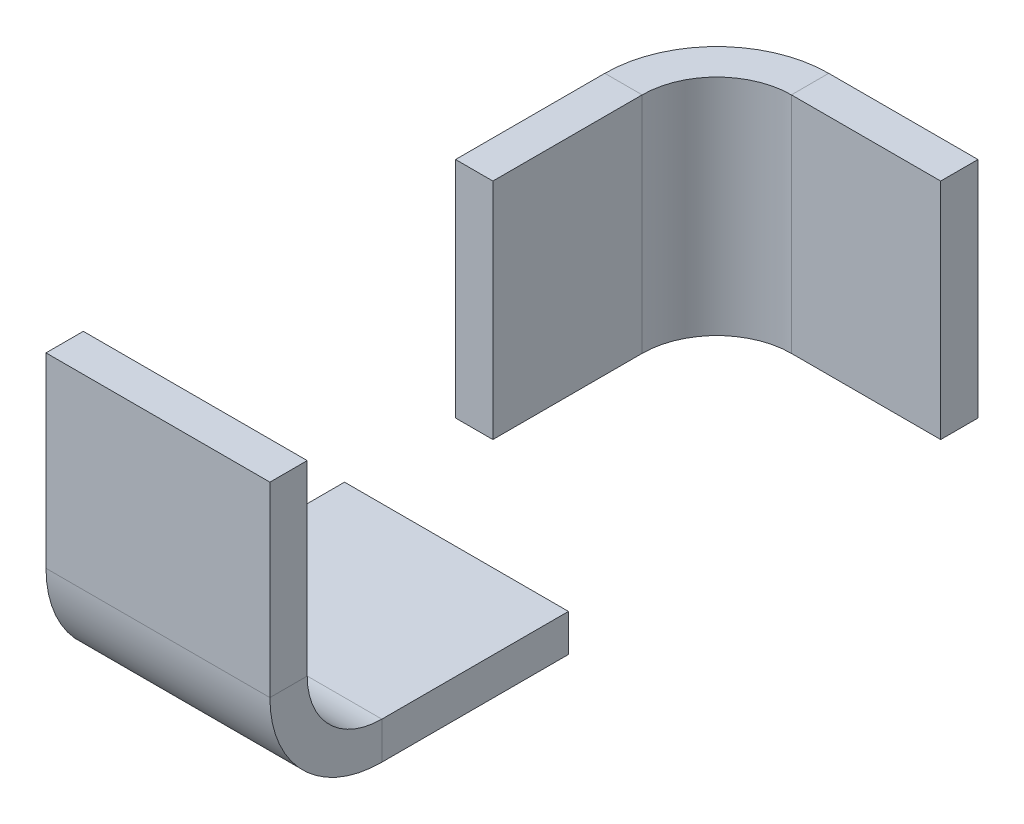
ISO-10303-21;
HEADER;
FILE_DESCRIPTION(('STEP AP214'),'2;1');
FILE_NAME('part.step','',(''),(''),'','','');
FILE_SCHEMA(('AUTOMOTIVE_DESIGN { 1 0 10303 214 1 1 1 1 }'));
ENDSEC;
DATA;
#1=APPLICATION_CONTEXT('core data for automotive mechanical design processes');
#2=APPLICATION_PROTOCOL_DEFINITION('international standard','automotive_design',2000,#1);
#3=PRODUCT_CONTEXT('',#1,'mechanical');
#4=PRODUCT('Part','Part','',(#3));
#5=PRODUCT_RELATED_PRODUCT_CATEGORY('part','',(#4));
#6=PRODUCT_DEFINITION_FORMATION('','',#4);
#7=PRODUCT_DEFINITION_CONTEXT('part definition',#1,'design');
#8=PRODUCT_DEFINITION('design','',#6,#7);
#9=PRODUCT_DEFINITION_SHAPE('','',#8);
#10=(LENGTH_UNIT() NAMED_UNIT(*) SI_UNIT(.MILLI.,.METRE.));
#11=(NAMED_UNIT(*) PLANE_ANGLE_UNIT() SI_UNIT($,.RADIAN.));
#12=(NAMED_UNIT(*) SI_UNIT($,.STERADIAN.) SOLID_ANGLE_UNIT());
#13=UNCERTAINTY_MEASURE_WITH_UNIT(LENGTH_MEASURE(1.E-05),#10,'distance_accuracy_value','');
#14=(GEOMETRIC_REPRESENTATION_CONTEXT(3) GLOBAL_UNCERTAINTY_ASSIGNED_CONTEXT((#13)) GLOBAL_UNIT_ASSIGNED_CONTEXT((#10,
#11,#12)) REPRESENTATION_CONTEXT('',''));
#15=CARTESIAN_POINT('',(0.,0.,0.));
#16=DIRECTION('',(0.,0.,1.));
#17=DIRECTION('',(1.,0.,0.));
#18=AXIS2_PLACEMENT_3D('',#15,#16,#17);
#19=CARTESIAN_POINT('',(60.,0.,79.7463558836899));
#20=DIRECTION('',(1.,0.,0.));
#21=DIRECTION('',(0.,0.,-1.));
#22=AXIS2_PLACEMENT_3D('',#19,#20,#21);
#23=PLANE('',#22);
#24=DIRECTION('',(0.,-1.,0.));
#25=VECTOR('',#24,1.);
#26=CARTESIAN_POINT('',(60.,0.,79.7463558836899));
#27=LINE('',#26,#25);
#28=CARTESIAN_POINT('',(60.,0.,79.7463558836899));
#29=VERTEX_POINT('',#28);
#30=CARTESIAN_POINT('',(60.,-10.,79.7463558836899));
#31=VERTEX_POINT('',#30);
#32=EDGE_CURVE('E12',#29,#31,#27,.T.);
#33=ORIENTED_EDGE('',*,*,#32,.F.);
#34=CARTESIAN_POINT('',(60.,20.,79.7463558836899));
#35=DIRECTION('',(-1.,0.,0.));
#36=DIRECTION('',(0.,0.,1.));
#37=AXIS2_PLACEMENT_3D('',#34,#35,#36);
#38=CIRCLE('',#37,20.);
#39=CARTESIAN_POINT('',(60.,20.,99.7463558836899));
#40=VERTEX_POINT('',#39);
#41=EDGE_CURVE('E146',#40,#29,#38,.F.);
#42=ORIENTED_EDGE('',*,*,#41,.F.);
#43=DIRECTION('',(0.,0.,-1.));
#44=VECTOR('',#43,1.);
#45=CARTESIAN_POINT('',(60.,20.,109.74635588369));
#46=LINE('',#45,#44);
#47=CARTESIAN_POINT('',(60.,20.,109.74635588369));
#48=VERTEX_POINT('',#47);
#49=EDGE_CURVE('E57',#48,#40,#46,.T.);
#50=ORIENTED_EDGE('',*,*,#49,.F.);
#51=CARTESIAN_POINT('',(60.,20.,79.7463558836899));
#52=DIRECTION('',(1.,0.,0.));
#53=DIRECTION('',(0.,0.,-1.));
#54=AXIS2_PLACEMENT_3D('',#51,#52,#53);
#55=CIRCLE('',#54,30.);
#56=EDGE_CURVE('E139',#48,#31,#55,.T.);
#57=ORIENTED_EDGE('',*,*,#56,.T.);
#58=EDGE_LOOP('',(#33,#42,#50,#57));
#59=FACE_BOUND('',#58,.T.);
#60=ADVANCED_FACE('F49',(#59),#23,.T.);
#61=CARTESIAN_POINT('',(60.,20.,109.74635588369));
#62=DIRECTION('',(1.,0.,0.));
#63=DIRECTION('',(0.,0.,-1.));
#64=AXIS2_PLACEMENT_3D('',#61,#62,#63);
#65=PLANE('',#64);
#66=DIRECTION('',(0.,0.,-1.));
#67=VECTOR('',#66,1.);
#68=CARTESIAN_POINT('',(60.,0.,99.7463558836899));
#69=LINE('',#68,#67);
#70=CARTESIAN_POINT('',(60.,0.,29.7463558836899));
#71=VERTEX_POINT('',#70);
#72=EDGE_CURVE('E195',#29,#71,#69,.T.);
#73=ORIENTED_EDGE('',*,*,#72,.F.);
#74=ORIENTED_EDGE('',*,*,#32,.T.);
#75=DIRECTION('',(0.,0.,-1.));
#76=VECTOR('',#75,1.);
#77=CARTESIAN_POINT('',(60.,-10.,99.7463558836899));
#78=LINE('',#77,#76);
#79=CARTESIAN_POINT('',(60.,-10.,29.7463558836899));
#80=VERTEX_POINT('',#79);
#81=EDGE_CURVE('E105',#31,#80,#78,.T.);
#82=ORIENTED_EDGE('',*,*,#81,.T.);
#83=DIRECTION('',(0.,-1.,0.));
#84=VECTOR('',#83,1.);
#85=CARTESIAN_POINT('',(60.,0.,29.7463558836899));
#86=LINE('',#85,#84);
#87=EDGE_CURVE('E352',#71,#80,#86,.T.);
#88=ORIENTED_EDGE('',*,*,#87,.F.);
#89=EDGE_LOOP('',(#73,#74,#82,#88));
#90=FACE_BOUND('',#89,.T.);
#91=ADVANCED_FACE('F203',(#90),#65,.T.);
#92=CARTESIAN_POINT('',(0.,20.,99.7463558836899));
#93=DIRECTION('',(-1.,0.,0.));
#94=DIRECTION('',(0.,0.,1.));
#95=AXIS2_PLACEMENT_3D('',#92,#93,#94);
#96=PLANE('',#95);
#97=DIRECTION('',(0.,0.,1.));
#98=VECTOR('',#97,1.);
#99=CARTESIAN_POINT('',(0.,20.,99.7463558836899));
#100=LINE('',#99,#98);
#101=CARTESIAN_POINT('',(0.,20.,99.7463558836899));
#102=VERTEX_POINT('',#101);
#103=CARTESIAN_POINT('',(0.,20.,109.74635588369));
#104=VERTEX_POINT('',#103);
#105=EDGE_CURVE('E92',#102,#104,#100,.T.);
#106=ORIENTED_EDGE('',*,*,#105,.F.);
#107=CARTESIAN_POINT('',(0.,20.,79.7463558836899));
#108=DIRECTION('',(-1.,0.,0.));
#109=DIRECTION('',(0.,0.,1.));
#110=AXIS2_PLACEMENT_3D('',#107,#108,#109);
#111=CIRCLE('',#110,20.);
#112=CARTESIAN_POINT('',(0.,0.,79.7463558836899));
#113=VERTEX_POINT('',#112);
#114=EDGE_CURVE('E161',#102,#113,#111,.F.);
#115=ORIENTED_EDGE('',*,*,#114,.T.);
#116=DIRECTION('',(0.,1.,0.));
#117=VECTOR('',#116,1.);
#118=CARTESIAN_POINT('',(0.,-10.,79.7463558836899));
#119=LINE('',#118,#117);
#120=CARTESIAN_POINT('',(0.,-10.,79.7463558836899));
#121=VERTEX_POINT('',#120);
#122=EDGE_CURVE('E99',#121,#113,#119,.T.);
#123=ORIENTED_EDGE('',*,*,#122,.F.);
#124=CARTESIAN_POINT('',(0.,20.,79.7463558836899));
#125=DIRECTION('',(1.,0.,0.));
#126=DIRECTION('',(0.,0.,-1.));
#127=AXIS2_PLACEMENT_3D('',#124,#125,#126);
#128=CIRCLE('',#127,30.);
#129=EDGE_CURVE('E168',#104,#121,#128,.T.);
#130=ORIENTED_EDGE('',*,*,#129,.F.);
#131=EDGE_LOOP('',(#106,#115,#123,#130));
#132=FACE_BOUND('',#131,.T.);
#133=ADVANCED_FACE('F201',(#132),#96,.T.);
#134=CARTESIAN_POINT('',(0.,-10.,79.7463558836899));
#135=DIRECTION('',(-1.,0.,0.));
#136=DIRECTION('',(0.,0.,1.));
#137=AXIS2_PLACEMENT_3D('',#134,#135,#136);
#138=PLANE('',#137);
#139=DIRECTION('',(0.,-1.,0.));
#140=VECTOR('',#139,1.);
#141=CARTESIAN_POINT('',(0.,70.,99.7463558836899));
#142=LINE('',#141,#140);
#143=CARTESIAN_POINT('',(0.,70.,99.7463558836899));
#144=VERTEX_POINT('',#143);
#145=EDGE_CURVE('E163',#144,#102,#142,.T.);
#146=ORIENTED_EDGE('',*,*,#145,.T.);
#147=ORIENTED_EDGE('',*,*,#105,.T.);
#148=DIRECTION('',(0.,1.,0.));
#149=VECTOR('',#148,1.);
#150=CARTESIAN_POINT('',(0.,70.,109.74635588369));
#151=LINE('',#150,#149);
#152=CARTESIAN_POINT('',(0.,70.,109.74635588369));
#153=VERTEX_POINT('',#152);
#154=EDGE_CURVE('E166',#153,#104,#151,.F.);
#155=ORIENTED_EDGE('',*,*,#154,.F.);
#156=DIRECTION('',(0.,0.,-1.));
#157=VECTOR('',#156,1.);
#158=CARTESIAN_POINT('',(0.,70.,109.74635588369));
#159=LINE('',#158,#157);
#160=EDGE_CURVE('E127',#153,#144,#159,.T.);
#161=ORIENTED_EDGE('',*,*,#160,.T.);
#162=EDGE_LOOP('',(#146,#147,#155,#161));
#163=FACE_BOUND('',#162,.T.);
#164=ADVANCED_FACE('F197',(#163),#138,.T.);
#165=CARTESIAN_POINT('',(60.,-10.,99.7463558836899));
#166=DIRECTION('',(0.,1.,0.));
#167=DIRECTION('',(0.,0.,1.));
#168=AXIS2_PLACEMENT_3D('',#165,#166,#167);
#169=PLANE('',#168);
#170=DIRECTION('',(0.,0.,-1.));
#171=VECTOR('',#170,1.);
#172=CARTESIAN_POINT('',(0.,-10.,99.7463558836899));
#173=LINE('',#172,#171);
#174=CARTESIAN_POINT('',(0.,-10.,29.7463558836899));
#175=VERTEX_POINT('',#174);
#176=EDGE_CURVE('E152',#121,#175,#173,.T.);
#177=ORIENTED_EDGE('',*,*,#176,.T.);
#178=DIRECTION('',(-1.,0.,0.));
#179=VECTOR('',#178,1.);
#180=CARTESIAN_POINT('',(60.,-10.,29.7463558836899));
#181=LINE('',#180,#179);
#182=EDGE_CURVE('E182',#80,#175,#181,.T.);
#183=ORIENTED_EDGE('',*,*,#182,.F.);
#184=ORIENTED_EDGE('',*,*,#81,.F.);
#185=DIRECTION('',(-1.,0.,0.));
#186=VECTOR('',#185,1.);
#187=CARTESIAN_POINT('',(60.,-10.,79.7463558836899));
#188=LINE('',#187,#186);
#189=EDGE_CURVE('E151',#31,#121,#188,.T.);
#190=ORIENTED_EDGE('',*,*,#189,.T.);
#191=EDGE_LOOP('',(#177,#183,#184,#190));
#192=FACE_BOUND('',#191,.T.);
#193=ADVANCED_FACE('F209',(#192),#169,.F.);
#194=CARTESIAN_POINT('',(60.,0.,29.7463558836899));
#195=DIRECTION('',(0.,0.,-1.));
#196=DIRECTION('',(-1.,0.,0.));
#197=AXIS2_PLACEMENT_3D('',#194,#195,#196);
#198=PLANE('',#197);
#199=DIRECTION('',(0.,-1.,0.));
#200=VECTOR('',#199,1.);
#201=CARTESIAN_POINT('',(0.,0.,29.7463558836899));
#202=LINE('',#201,#200);
#203=CARTESIAN_POINT('',(0.,0.,29.7463558836899));
#204=VERTEX_POINT('',#203);
#205=EDGE_CURVE('E155',#204,#175,#202,.T.);
#206=ORIENTED_EDGE('',*,*,#205,.F.);
#207=DIRECTION('',(-1.,0.,0.));
#208=VECTOR('',#207,1.);
#209=CARTESIAN_POINT('',(60.,0.,29.7463558836899));
#210=LINE('',#209,#208);
#211=EDGE_CURVE('E180',#71,#204,#210,.T.);
#212=ORIENTED_EDGE('',*,*,#211,.F.);
#213=ORIENTED_EDGE('',*,*,#87,.T.);
#214=ORIENTED_EDGE('',*,*,#182,.T.);
#215=EDGE_LOOP('',(#206,#212,#213,#214));
#216=FACE_BOUND('',#215,.T.);
#217=ADVANCED_FACE('F240',(#216),#198,.T.);
#218=CARTESIAN_POINT('',(60.,0.,99.7463558836899));
#219=DIRECTION('',(0.,1.,0.));
#220=DIRECTION('',(0.,0.,1.));
#221=AXIS2_PLACEMENT_3D('',#218,#219,#220);
#222=PLANE('',#221);
#223=DIRECTION('',(0.,0.,-1.));
#224=VECTOR('',#223,1.);
#225=CARTESIAN_POINT('',(0.,0.,99.7463558836899));
#226=LINE('',#225,#224);
#227=EDGE_CURVE('E158',#113,#204,#226,.T.);
#228=ORIENTED_EDGE('',*,*,#227,.F.);
#229=DIRECTION('',(-1.,0.,0.));
#230=VECTOR('',#229,1.);
#231=CARTESIAN_POINT('',(60.,0.,79.7463558836899));
#232=LINE('',#231,#230);
#233=EDGE_CURVE('E177',#29,#113,#232,.T.);
#234=ORIENTED_EDGE('',*,*,#233,.F.);
#235=ORIENTED_EDGE('',*,*,#72,.T.);
#236=ORIENTED_EDGE('',*,*,#211,.T.);
#237=EDGE_LOOP('',(#228,#234,#235,#236));
#238=FACE_BOUND('',#237,.T.);
#239=ADVANCED_FACE('F251',(#238),#222,.T.);
#240=CARTESIAN_POINT('',(60.,20.,79.7463558836899));
#241=DIRECTION('',(-1.,0.,0.));
#242=DIRECTION('',(0.,0.,1.));
#243=AXIS2_PLACEMENT_3D('',#240,#241,#242);
#244=CYLINDRICAL_SURFACE('',#243,20.);
#245=ORIENTED_EDGE('',*,*,#114,.F.);
#246=DIRECTION('',(-1.,0.,0.));
#247=VECTOR('',#246,1.);
#248=CARTESIAN_POINT('',(60.,20.,99.7463558836899));
#249=LINE('',#248,#247);
#250=EDGE_CURVE('E174',#40,#102,#249,.T.);
#251=ORIENTED_EDGE('',*,*,#250,.F.);
#252=ORIENTED_EDGE('',*,*,#41,.T.);
#253=ORIENTED_EDGE('',*,*,#233,.T.);
#254=EDGE_LOOP('',(#245,#251,#252,#253));
#255=FACE_BOUND('',#254,.T.);
#256=ADVANCED_FACE('F191',(#255),#244,.F.);
#257=CARTESIAN_POINT('',(60.,70.,99.7463558836899));
#258=DIRECTION('',(0.,0.,-1.));
#259=DIRECTION('',(-1.,0.,0.));
#260=AXIS2_PLACEMENT_3D('',#257,#258,#259);
#261=PLANE('',#260);
#262=ORIENTED_EDGE('',*,*,#145,.F.);
#263=DIRECTION('',(-1.,0.,0.));
#264=VECTOR('',#263,1.);
#265=CARTESIAN_POINT('',(60.,70.,99.7463558836899));
#266=LINE('',#265,#264);
#267=CARTESIAN_POINT('',(60.,70.,99.7463558836899));
#268=VERTEX_POINT('',#267);
#269=EDGE_CURVE('E129',#268,#144,#266,.T.);
#270=ORIENTED_EDGE('',*,*,#269,.F.);
#271=DIRECTION('',(0.,-1.,0.));
#272=VECTOR('',#271,1.);
#273=CARTESIAN_POINT('',(60.,70.,99.7463558836899));
#274=LINE('',#273,#272);
#275=EDGE_CURVE('E144',#268,#40,#274,.T.);
#276=ORIENTED_EDGE('',*,*,#275,.T.);
#277=ORIENTED_EDGE('',*,*,#250,.T.);
#278=EDGE_LOOP('',(#262,#270,#276,#277));
#279=FACE_BOUND('',#278,.T.);
#280=ADVANCED_FACE('F196',(#279),#261,.T.);
#281=CARTESIAN_POINT('',(60.,70.,109.74635588369));
#282=DIRECTION('',(0.,1.,0.));
#283=DIRECTION('',(0.,0.,1.));
#284=AXIS2_PLACEMENT_3D('',#281,#282,#283);
#285=PLANE('',#284);
#286=ORIENTED_EDGE('',*,*,#160,.F.);
#287=DIRECTION('',(-1.,0.,0.));
#288=VECTOR('',#287,1.);
#289=CARTESIAN_POINT('',(60.,70.,109.74635588369));
#290=LINE('',#289,#288);
#291=CARTESIAN_POINT('',(60.,70.,109.74635588369));
#292=VERTEX_POINT('',#291);
#293=EDGE_CURVE('E121',#292,#153,#290,.T.);
#294=ORIENTED_EDGE('',*,*,#293,.F.);
#295=DIRECTION('',(0.,0.,-1.));
#296=VECTOR('',#295,1.);
#297=CARTESIAN_POINT('',(60.,70.,109.74635588369));
#298=LINE('',#297,#296);
#299=EDGE_CURVE('E125',#292,#268,#298,.T.);
#300=ORIENTED_EDGE('',*,*,#299,.T.);
#301=ORIENTED_EDGE('',*,*,#269,.T.);
#302=EDGE_LOOP('',(#286,#294,#300,#301));
#303=FACE_BOUND('',#302,.T.);
#304=ADVANCED_FACE('F123',(#303),#285,.T.);
#305=CARTESIAN_POINT('',(60.,70.,109.74635588369));
#306=DIRECTION('',(0.,0.,-1.));
#307=DIRECTION('',(-1.,0.,0.));
#308=AXIS2_PLACEMENT_3D('',#305,#306,#307);
#309=PLANE('',#308);
#310=ORIENTED_EDGE('',*,*,#154,.T.);
#311=DIRECTION('',(-1.,0.,0.));
#312=VECTOR('',#311,1.);
#313=CARTESIAN_POINT('',(60.,20.,109.74635588369));
#314=LINE('',#313,#312);
#315=EDGE_CURVE('E130',#48,#104,#314,.T.);
#316=ORIENTED_EDGE('',*,*,#315,.F.);
#317=DIRECTION('',(0.,1.,0.));
#318=VECTOR('',#317,1.);
#319=CARTESIAN_POINT('',(60.,70.,109.74635588369));
#320=LINE('',#319,#318);
#321=EDGE_CURVE('E134',#292,#48,#320,.F.);
#322=ORIENTED_EDGE('',*,*,#321,.F.);
#323=ORIENTED_EDGE('',*,*,#293,.T.);
#324=EDGE_LOOP('',(#310,#316,#322,#323));
#325=FACE_BOUND('',#324,.T.);
#326=ADVANCED_FACE('F135',(#325),#309,.F.);
#327=CARTESIAN_POINT('',(60.,20.,79.7463558836899));
#328=DIRECTION('',(-1.,0.,0.));
#329=DIRECTION('',(0.,0.,1.));
#330=AXIS2_PLACEMENT_3D('',#327,#328,#329);
#331=CYLINDRICAL_SURFACE('',#330,30.);
#332=ORIENTED_EDGE('',*,*,#129,.T.);
#333=ORIENTED_EDGE('',*,*,#189,.F.);
#334=ORIENTED_EDGE('',*,*,#56,.F.);
#335=ORIENTED_EDGE('',*,*,#315,.T.);
#336=EDGE_LOOP('',(#332,#333,#334,#335));
#337=FACE_BOUND('',#336,.T.);
#338=ADVANCED_FACE('F199',(#337),#331,.T.);
#339=CARTESIAN_POINT('',(60.,20.,79.7463558836899));
#340=DIRECTION('',(-1.,0.,0.));
#341=DIRECTION('',(0.,0.,1.));
#342=AXIS2_PLACEMENT_3D('',#339,#340,#341);
#343=PLANE('',#342);
#344=ORIENTED_EDGE('',*,*,#321,.T.);
#345=ORIENTED_EDGE('',*,*,#49,.T.);
#346=ORIENTED_EDGE('',*,*,#275,.F.);
#347=ORIENTED_EDGE('',*,*,#299,.F.);
#348=EDGE_LOOP('',(#344,#345,#346,#347));
#349=FACE_BOUND('',#348,.T.);
#350=ADVANCED_FACE('F142',(#349),#343,.F.);
#351=CARTESIAN_POINT('',(0.,20.,79.7463558836899));
#352=DIRECTION('',(-1.,0.,0.));
#353=DIRECTION('',(0.,0.,1.));
#354=AXIS2_PLACEMENT_3D('',#351,#352,#353);
#355=PLANE('',#354);
#356=ORIENTED_EDGE('',*,*,#176,.F.);
#357=ORIENTED_EDGE('',*,*,#122,.T.);
#358=ORIENTED_EDGE('',*,*,#227,.T.);
#359=ORIENTED_EDGE('',*,*,#205,.T.);
#360=EDGE_LOOP('',(#356,#357,#358,#359));
#361=FACE_BOUND('',#360,.T.);
#362=ADVANCED_FACE('F317',(#361),#355,.T.);
#363=CLOSED_SHELL('',(#60,#91,#133,#164,#193,#217,#239,#256,#280,#304,#326,#338,#350,#362));
#364=MANIFOLD_SOLID_BREP('B2',#363);
#365=CARTESIAN_POINT('',(30.,60.,-70.));
#366=DIRECTION('',(0.,1.,0.));
#367=DIRECTION('',(0.,0.,1.));
#368=AXIS2_PLACEMENT_3D('',#365,#366,#367);
#369=PLANE('',#368);
#370=DIRECTION('',(0.,0.,1.));
#371=VECTOR('',#370,1.);
#372=CARTESIAN_POINT('',(30.,60.,-70.));
#373=LINE('',#372,#371);
#374=CARTESIAN_POINT('',(30.,60.,-70.));
#375=VERTEX_POINT('',#374);
#376=CARTESIAN_POINT('',(30.,60.,-60.));
#377=VERTEX_POINT('',#376);
#378=EDGE_CURVE('E47',#375,#377,#373,.T.);
#379=ORIENTED_EDGE('',*,*,#378,.F.);
#380=CARTESIAN_POINT('',(30.,60.,-40.));
#381=DIRECTION('',(0.,1.,0.));
#382=DIRECTION('',(0.,0.,1.));
#383=AXIS2_PLACEMENT_3D('',#380,#381,#382);
#384=CIRCLE('',#383,30.);
#385=CARTESIAN_POINT('',(0.,60.,-40.));
#386=VERTEX_POINT('',#385);
#387=EDGE_CURVE('E458',#386,#375,#384,.F.);
#388=ORIENTED_EDGE('',*,*,#387,.F.);
#389=DIRECTION('',(-1.,0.,0.));
#390=VECTOR('',#389,1.);
#391=CARTESIAN_POINT('',(10.,60.,-40.));
#392=LINE('',#391,#390);
#393=CARTESIAN_POINT('',(10.,60.,-40.));
#394=VERTEX_POINT('',#393);
#395=EDGE_CURVE('E369',#394,#386,#392,.T.);
#396=ORIENTED_EDGE('',*,*,#395,.F.);
#397=CARTESIAN_POINT('',(30.,60.,-40.));
#398=DIRECTION('',(0.,1.,0.));
#399=DIRECTION('',(1.,0.,0.));
#400=AXIS2_PLACEMENT_3D('',#397,#398,#399);
#401=CIRCLE('',#400,20.);
#402=EDGE_CURVE('E451',#394,#377,#401,.F.);
#403=ORIENTED_EDGE('',*,*,#402,.T.);
#404=EDGE_LOOP('',(#379,#388,#396,#403));
#405=FACE_BOUND('',#404,.T.);
#406=ADVANCED_FACE('F361',(#405),#369,.T.);
#407=CARTESIAN_POINT('',(10.,60.,-40.));
#408=DIRECTION('',(0.,1.,0.));
#409=DIRECTION('',(0.,0.,1.));
#410=AXIS2_PLACEMENT_3D('',#407,#408,#409);
#411=PLANE('',#410);
#412=DIRECTION('',(1.,0.,0.));
#413=VECTOR('',#412,1.);
#414=CARTESIAN_POINT('',(0.,60.,-70.));
#415=LINE('',#414,#413);
#416=CARTESIAN_POINT('',(70.,60.,-70.));
#417=VERTEX_POINT('',#416);
#418=EDGE_CURVE('E507',#375,#417,#415,.T.);
#419=ORIENTED_EDGE('',*,*,#418,.F.);
#420=ORIENTED_EDGE('',*,*,#378,.T.);
#421=DIRECTION('',(1.,0.,0.));
#422=VECTOR('',#421,1.);
#423=CARTESIAN_POINT('',(0.,60.,-60.));
#424=LINE('',#423,#422);
#425=CARTESIAN_POINT('',(70.,60.,-60.));
#426=VERTEX_POINT('',#425);
#427=EDGE_CURVE('E417',#377,#426,#424,.T.);
#428=ORIENTED_EDGE('',*,*,#427,.T.);
#429=DIRECTION('',(0.,0.,1.));
#430=VECTOR('',#429,1.);
#431=CARTESIAN_POINT('',(70.,60.,-70.));
#432=LINE('',#431,#430);
#433=EDGE_CURVE('E664',#417,#426,#432,.T.);
#434=ORIENTED_EDGE('',*,*,#433,.F.);
#435=EDGE_LOOP('',(#419,#420,#428,#434));
#436=FACE_BOUND('',#435,.T.);
#437=ADVANCED_FACE('F515',(#436),#411,.T.);
#438=CARTESIAN_POINT('',(0.,0.,-40.));
#439=DIRECTION('',(0.,-1.,0.));
#440=DIRECTION('',(0.,0.,-1.));
#441=AXIS2_PLACEMENT_3D('',#438,#439,#440);
#442=PLANE('',#441);
#443=DIRECTION('',(1.,0.,0.));
#444=VECTOR('',#443,1.);
#445=CARTESIAN_POINT('',(0.,0.,-40.));
#446=LINE('',#445,#444);
#447=CARTESIAN_POINT('',(0.,0.,-40.));
#448=VERTEX_POINT('',#447);
#449=CARTESIAN_POINT('',(10.,0.,-40.));
#450=VERTEX_POINT('',#449);
#451=EDGE_CURVE('E404',#448,#450,#446,.T.);
#452=ORIENTED_EDGE('',*,*,#451,.F.);
#453=CARTESIAN_POINT('',(30.,0.,-40.));
#454=DIRECTION('',(0.,1.,0.));
#455=DIRECTION('',(0.,0.,1.));
#456=AXIS2_PLACEMENT_3D('',#453,#454,#455);
#457=CIRCLE('',#456,30.);
#458=CARTESIAN_POINT('',(30.,0.,-70.));
#459=VERTEX_POINT('',#458);
#460=EDGE_CURVE('E473',#448,#459,#457,.F.);
#461=ORIENTED_EDGE('',*,*,#460,.T.);
#462=DIRECTION('',(0.,0.,-1.));
#463=VECTOR('',#462,1.);
#464=CARTESIAN_POINT('',(30.,0.,-60.));
#465=LINE('',#464,#463);
#466=CARTESIAN_POINT('',(30.,0.,-60.));
#467=VERTEX_POINT('',#466);
#468=EDGE_CURVE('E411',#467,#459,#465,.T.);
#469=ORIENTED_EDGE('',*,*,#468,.F.);
#470=CARTESIAN_POINT('',(30.,0.,-40.));
#471=DIRECTION('',(0.,1.,0.));
#472=DIRECTION('',(1.,0.,0.));
#473=AXIS2_PLACEMENT_3D('',#470,#471,#472);
#474=CIRCLE('',#473,20.);
#475=EDGE_CURVE('E480',#450,#467,#474,.F.);
#476=ORIENTED_EDGE('',*,*,#475,.F.);
#477=EDGE_LOOP('',(#452,#461,#469,#476));
#478=FACE_BOUND('',#477,.T.);
#479=ADVANCED_FACE('F513',(#478),#442,.T.);
#480=CARTESIAN_POINT('',(30.,0.,-60.));
#481=DIRECTION('',(0.,-1.,0.));
#482=DIRECTION('',(0.,0.,-1.));
#483=AXIS2_PLACEMENT_3D('',#480,#481,#482);
#484=PLANE('',#483);
#485=DIRECTION('',(0.,0.,-1.));
#486=VECTOR('',#485,1.);
#487=CARTESIAN_POINT('',(0.,0.,0.));
#488=LINE('',#487,#486);
#489=CARTESIAN_POINT('',(0.,0.,0.));
#490=VERTEX_POINT('',#489);
#491=EDGE_CURVE('E475',#490,#448,#488,.T.);
#492=ORIENTED_EDGE('',*,*,#491,.T.);
#493=ORIENTED_EDGE('',*,*,#451,.T.);
#494=DIRECTION('',(0.,0.,-1.));
#495=VECTOR('',#494,1.);
#496=CARTESIAN_POINT('',(10.,0.,0.));
#497=LINE('',#496,#495);
#498=CARTESIAN_POINT('',(10.,0.,0.));
#499=VERTEX_POINT('',#498);
#500=EDGE_CURVE('E478',#499,#450,#497,.T.);
#501=ORIENTED_EDGE('',*,*,#500,.F.);
#502=DIRECTION('',(-1.,0.,0.));
#503=VECTOR('',#502,1.);
#504=CARTESIAN_POINT('',(10.,0.,0.));
#505=LINE('',#504,#503);
#506=EDGE_CURVE('E439',#499,#490,#505,.T.);
#507=ORIENTED_EDGE('',*,*,#506,.T.);
#508=EDGE_LOOP('',(#492,#493,#501,#507));
#509=FACE_BOUND('',#508,.T.);
#510=ADVANCED_FACE('F509',(#509),#484,.T.);
#511=CARTESIAN_POINT('',(0.,60.,-60.));
#512=DIRECTION('',(0.,0.,-1.));
#513=DIRECTION('',(-1.,0.,0.));
#514=AXIS2_PLACEMENT_3D('',#511,#512,#513);
#515=PLANE('',#514);
#516=DIRECTION('',(1.,0.,0.));
#517=VECTOR('',#516,1.);
#518=CARTESIAN_POINT('',(0.,0.,-60.));
#519=LINE('',#518,#517);
#520=CARTESIAN_POINT('',(70.,0.,-60.));
#521=VERTEX_POINT('',#520);
#522=EDGE_CURVE('E464',#467,#521,#519,.T.);
#523=ORIENTED_EDGE('',*,*,#522,.T.);
#524=DIRECTION('',(0.,-1.,0.));
#525=VECTOR('',#524,1.);
#526=CARTESIAN_POINT('',(70.,60.,-60.));
#527=LINE('',#526,#525);
#528=EDGE_CURVE('E494',#426,#521,#527,.T.);
#529=ORIENTED_EDGE('',*,*,#528,.F.);
#530=ORIENTED_EDGE('',*,*,#427,.F.);
#531=DIRECTION('',(0.,-1.,0.));
#532=VECTOR('',#531,1.);
#533=CARTESIAN_POINT('',(30.,60.,-60.));
#534=LINE('',#533,#532);
#535=EDGE_CURVE('E463',#377,#467,#534,.T.);
#536=ORIENTED_EDGE('',*,*,#535,.T.);
#537=EDGE_LOOP('',(#523,#529,#530,#536));
#538=FACE_BOUND('',#537,.T.);
#539=ADVANCED_FACE('F521',(#538),#515,.F.);
#540=CARTESIAN_POINT('',(70.,60.,-70.));
#541=DIRECTION('',(1.,0.,0.));
#542=DIRECTION('',(0.,0.,-1.));
#543=AXIS2_PLACEMENT_3D('',#540,#541,#542);
#544=PLANE('',#543);
#545=DIRECTION('',(0.,0.,1.));
#546=VECTOR('',#545,1.);
#547=CARTESIAN_POINT('',(70.,0.,-70.));
#548=LINE('',#547,#546);
#549=CARTESIAN_POINT('',(70.,0.,-70.));
#550=VERTEX_POINT('',#549);
#551=EDGE_CURVE('E467',#550,#521,#548,.T.);
#552=ORIENTED_EDGE('',*,*,#551,.F.);
#553=DIRECTION('',(0.,-1.,0.));
#554=VECTOR('',#553,1.);
#555=CARTESIAN_POINT('',(70.,60.,-70.));
#556=LINE('',#555,#554);
#557=EDGE_CURVE('E492',#417,#550,#556,.T.);
#558=ORIENTED_EDGE('',*,*,#557,.F.);
#559=ORIENTED_EDGE('',*,*,#433,.T.);
#560=ORIENTED_EDGE('',*,*,#528,.T.);
#561=EDGE_LOOP('',(#552,#558,#559,#560));
#562=FACE_BOUND('',#561,.T.);
#563=ADVANCED_FACE('F552',(#562),#544,.T.);
#564=CARTESIAN_POINT('',(0.,60.,-70.));
#565=DIRECTION('',(0.,0.,-1.));
#566=DIRECTION('',(-1.,0.,0.));
#567=AXIS2_PLACEMENT_3D('',#564,#565,#566);
#568=PLANE('',#567);
#569=DIRECTION('',(1.,0.,0.));
#570=VECTOR('',#569,1.);
#571=CARTESIAN_POINT('',(0.,0.,-70.));
#572=LINE('',#571,#570);
#573=EDGE_CURVE('E470',#459,#550,#572,.T.);
#574=ORIENTED_EDGE('',*,*,#573,.F.);
#575=DIRECTION('',(0.,-1.,0.));
#576=VECTOR('',#575,1.);
#577=CARTESIAN_POINT('',(30.,60.,-70.));
#578=LINE('',#577,#576);
#579=EDGE_CURVE('E489',#375,#459,#578,.T.);
#580=ORIENTED_EDGE('',*,*,#579,.F.);
#581=ORIENTED_EDGE('',*,*,#418,.T.);
#582=ORIENTED_EDGE('',*,*,#557,.T.);
#583=EDGE_LOOP('',(#574,#580,#581,#582));
#584=FACE_BOUND('',#583,.T.);
#585=ADVANCED_FACE('F563',(#584),#568,.T.);
#586=CARTESIAN_POINT('',(30.,60.,-40.));
#587=DIRECTION('',(0.,-1.,0.));
#588=DIRECTION('',(0.,0.,-1.));
#589=AXIS2_PLACEMENT_3D('',#586,#587,#588);
#590=CYLINDRICAL_SURFACE('',#589,30.);
#591=ORIENTED_EDGE('',*,*,#460,.F.);
#592=DIRECTION('',(0.,-1.,0.));
#593=VECTOR('',#592,1.);
#594=CARTESIAN_POINT('',(0.,60.,-40.));
#595=LINE('',#594,#593);
#596=EDGE_CURVE('E486',#386,#448,#595,.T.);
#597=ORIENTED_EDGE('',*,*,#596,.F.);
#598=ORIENTED_EDGE('',*,*,#387,.T.);
#599=ORIENTED_EDGE('',*,*,#579,.T.);
#600=EDGE_LOOP('',(#591,#597,#598,#599));
#601=FACE_BOUND('',#600,.T.);
#602=ADVANCED_FACE('F503',(#601),#590,.T.);
#603=CARTESIAN_POINT('',(0.,60.,0.));
#604=DIRECTION('',(-1.,0.,0.));
#605=DIRECTION('',(0.,0.,1.));
#606=AXIS2_PLACEMENT_3D('',#603,#604,#605);
#607=PLANE('',#606);
#608=ORIENTED_EDGE('',*,*,#491,.F.);
#609=DIRECTION('',(0.,-1.,0.));
#610=VECTOR('',#609,1.);
#611=CARTESIAN_POINT('',(0.,60.,0.));
#612=LINE('',#611,#610);
#613=CARTESIAN_POINT('',(0.,60.,0.));
#614=VERTEX_POINT('',#613);
#615=EDGE_CURVE('E441',#614,#490,#612,.T.);
#616=ORIENTED_EDGE('',*,*,#615,.F.);
#617=DIRECTION('',(0.,0.,-1.));
#618=VECTOR('',#617,1.);
#619=CARTESIAN_POINT('',(0.,60.,0.));
#620=LINE('',#619,#618);
#621=EDGE_CURVE('E456',#614,#386,#620,.T.);
#622=ORIENTED_EDGE('',*,*,#621,.T.);
#623=ORIENTED_EDGE('',*,*,#596,.T.);
#624=EDGE_LOOP('',(#608,#616,#622,#623));
#625=FACE_BOUND('',#624,.T.);
#626=ADVANCED_FACE('F508',(#625),#607,.T.);
#627=CARTESIAN_POINT('',(10.,60.,0.));
#628=DIRECTION('',(0.,0.,1.));
#629=DIRECTION('',(1.,0.,0.));
#630=AXIS2_PLACEMENT_3D('',#627,#628,#629);
#631=PLANE('',#630);
#632=ORIENTED_EDGE('',*,*,#506,.F.);
#633=DIRECTION('',(0.,-1.,0.));
#634=VECTOR('',#633,1.);
#635=CARTESIAN_POINT('',(10.,60.,0.));
#636=LINE('',#635,#634);
#637=CARTESIAN_POINT('',(10.,60.,0.));
#638=VERTEX_POINT('',#637);
#639=EDGE_CURVE('E433',#638,#499,#636,.T.);
#640=ORIENTED_EDGE('',*,*,#639,.F.);
#641=DIRECTION('',(-1.,0.,0.));
#642=VECTOR('',#641,1.);
#643=CARTESIAN_POINT('',(10.,60.,0.));
#644=LINE('',#643,#642);
#645=EDGE_CURVE('E437',#638,#614,#644,.T.);
#646=ORIENTED_EDGE('',*,*,#645,.T.);
#647=ORIENTED_EDGE('',*,*,#615,.T.);
#648=EDGE_LOOP('',(#632,#640,#646,#647));
#649=FACE_BOUND('',#648,.T.);
#650=ADVANCED_FACE('F435',(#649),#631,.T.);
#651=CARTESIAN_POINT('',(10.,60.,0.));
#652=DIRECTION('',(-1.,0.,0.));
#653=DIRECTION('',(0.,0.,1.));
#654=AXIS2_PLACEMENT_3D('',#651,#652,#653);
#655=PLANE('',#654);
#656=ORIENTED_EDGE('',*,*,#500,.T.);
#657=DIRECTION('',(0.,-1.,0.));
#658=VECTOR('',#657,1.);
#659=CARTESIAN_POINT('',(10.,60.,-40.));
#660=LINE('',#659,#658);
#661=EDGE_CURVE('E442',#394,#450,#660,.T.);
#662=ORIENTED_EDGE('',*,*,#661,.F.);
#663=DIRECTION('',(0.,0.,-1.));
#664=VECTOR('',#663,1.);
#665=CARTESIAN_POINT('',(10.,60.,0.));
#666=LINE('',#665,#664);
#667=EDGE_CURVE('E446',#638,#394,#666,.T.);
#668=ORIENTED_EDGE('',*,*,#667,.F.);
#669=ORIENTED_EDGE('',*,*,#639,.T.);
#670=EDGE_LOOP('',(#656,#662,#668,#669));
#671=FACE_BOUND('',#670,.T.);
#672=ADVANCED_FACE('F447',(#671),#655,.F.);
#673=CARTESIAN_POINT('',(30.,60.,-40.));
#674=DIRECTION('',(0.,-1.,0.));
#675=DIRECTION('',(0.,0.,-1.));
#676=AXIS2_PLACEMENT_3D('',#673,#674,#675);
#677=CYLINDRICAL_SURFACE('',#676,20.);
#678=ORIENTED_EDGE('',*,*,#475,.T.);
#679=ORIENTED_EDGE('',*,*,#535,.F.);
#680=ORIENTED_EDGE('',*,*,#402,.F.);
#681=ORIENTED_EDGE('',*,*,#661,.T.);
#682=EDGE_LOOP('',(#678,#679,#680,#681));
#683=FACE_BOUND('',#682,.T.);
#684=ADVANCED_FACE('F511',(#683),#677,.F.);
#685=CARTESIAN_POINT('',(30.,60.,-40.));
#686=DIRECTION('',(0.,1.,0.));
#687=DIRECTION('',(1.,0.,0.));
#688=AXIS2_PLACEMENT_3D('',#685,#686,#687);
#689=PLANE('',#688);
#690=ORIENTED_EDGE('',*,*,#667,.T.);
#691=ORIENTED_EDGE('',*,*,#395,.T.);
#692=ORIENTED_EDGE('',*,*,#621,.F.);
#693=ORIENTED_EDGE('',*,*,#645,.F.);
#694=EDGE_LOOP('',(#690,#691,#692,#693));
#695=FACE_BOUND('',#694,.T.);
#696=ADVANCED_FACE('F454',(#695),#689,.T.);
#697=CARTESIAN_POINT('',(30.,0.,-40.));
#698=DIRECTION('',(0.,1.,0.));
#699=DIRECTION('',(1.,0.,0.));
#700=AXIS2_PLACEMENT_3D('',#697,#698,#699);
#701=PLANE('',#700);
#702=ORIENTED_EDGE('',*,*,#522,.F.);
#703=ORIENTED_EDGE('',*,*,#468,.T.);
#704=ORIENTED_EDGE('',*,*,#573,.T.);
#705=ORIENTED_EDGE('',*,*,#551,.T.);
#706=EDGE_LOOP('',(#702,#703,#704,#705));
#707=FACE_BOUND('',#706,.T.);
#708=ADVANCED_FACE('F629',(#707),#701,.F.);
#709=CLOSED_SHELL('',(#406,#437,#479,#510,#539,#563,#585,#602,#626,#650,#672,#684,#696,#708));
#710=MANIFOLD_SOLID_BREP('B6',#709);
#711=ADVANCED_BREP_SHAPE_REPRESENTATION('',(#18,#364,#710),#14);
#712=SHAPE_DEFINITION_REPRESENTATION(#9,#711);
ENDSEC;
END-ISO-10303-21;
